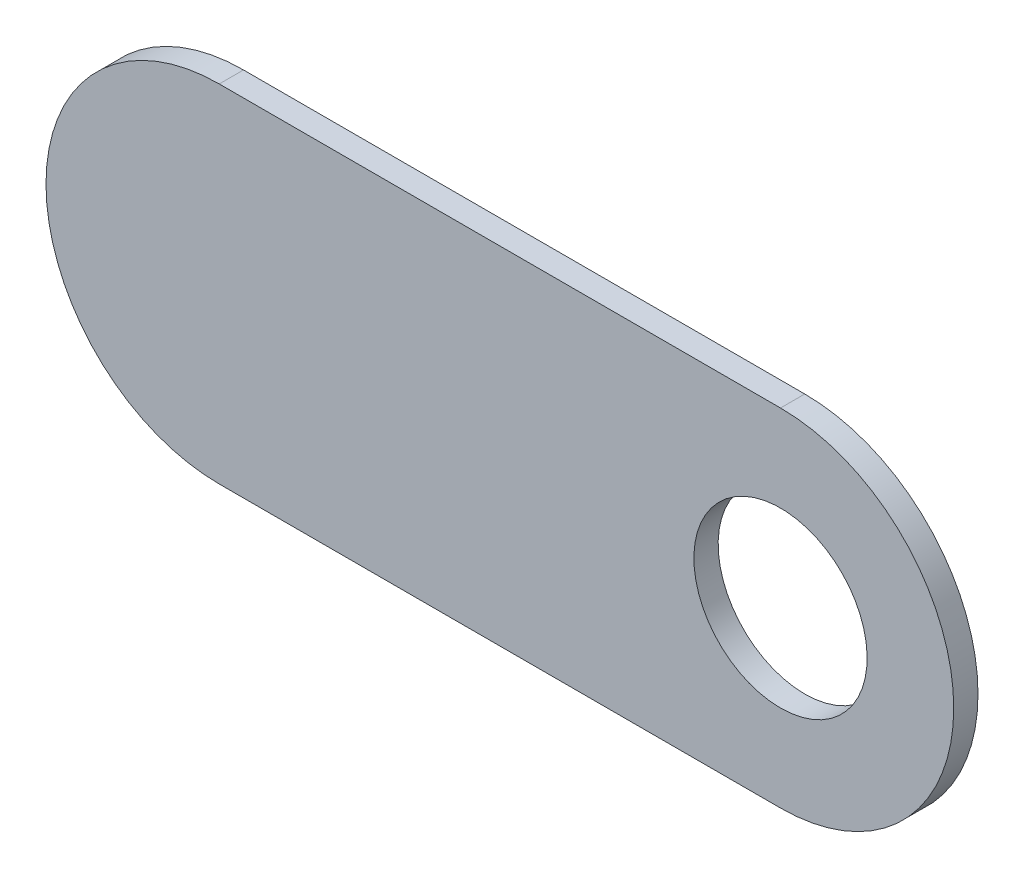
ISO-10303-21;
HEADER;
FILE_DESCRIPTION(('STEP AP214'),'2;1');
FILE_NAME('part.step','',(''),(''),'','','');
FILE_SCHEMA(('AUTOMOTIVE_DESIGN { 1 0 10303 214 1 1 1 1 }'));
ENDSEC;
DATA;
#1=APPLICATION_CONTEXT('core data for automotive mechanical design processes');
#2=APPLICATION_PROTOCOL_DEFINITION('international standard','automotive_design',2000,#1);
#3=PRODUCT_CONTEXT('',#1,'mechanical');
#4=PRODUCT('Part','Part','',(#3));
#5=PRODUCT_RELATED_PRODUCT_CATEGORY('part','',(#4));
#6=PRODUCT_DEFINITION_FORMATION('','',#4);
#7=PRODUCT_DEFINITION_CONTEXT('part definition',#1,'design');
#8=PRODUCT_DEFINITION('design','',#6,#7);
#9=PRODUCT_DEFINITION_SHAPE('','',#8);
#10=(LENGTH_UNIT() NAMED_UNIT(*) SI_UNIT(.MILLI.,.METRE.));
#11=(NAMED_UNIT(*) PLANE_ANGLE_UNIT() SI_UNIT($,.RADIAN.));
#12=(NAMED_UNIT(*) SI_UNIT($,.STERADIAN.) SOLID_ANGLE_UNIT());
#13=UNCERTAINTY_MEASURE_WITH_UNIT(LENGTH_MEASURE(1.E-05),#10,'distance_accuracy_value','');
#14=(GEOMETRIC_REPRESENTATION_CONTEXT(3) GLOBAL_UNCERTAINTY_ASSIGNED_CONTEXT((#13)) GLOBAL_UNIT_ASSIGNED_CONTEXT((#10,
#11,#12)) REPRESENTATION_CONTEXT('',''));
#15=CARTESIAN_POINT('',(0.,0.,0.));
#16=DIRECTION('',(0.,0.,1.));
#17=DIRECTION('',(1.,0.,0.));
#18=AXIS2_PLACEMENT_3D('',#15,#16,#17);
#19=CARTESIAN_POINT('',(79.4,-116.,-0.045));
#20=DIRECTION('',(0.,0.,-1.));
#21=DIRECTION('',(0.,-1.,0.));
#22=AXIS2_PLACEMENT_3D('',#19,#20,#21);
#23=CYLINDRICAL_SURFACE('',#22,0.125);
#24=CARTESIAN_POINT('',(79.4,-116.,1.6));
#25=DIRECTION('',(0.,0.,-1.));
#26=DIRECTION('',(0.,-1.,0.));
#27=AXIS2_PLACEMENT_3D('',#24,#25,#26);
#28=CIRCLE('',#27,0.125);
#29=CARTESIAN_POINT('',(79.4,-116.125,1.6));
#30=VERTEX_POINT('',#29);
#31=EDGE_CURVE('E114',#30,#30,#28,.T.);
#32=ORIENTED_EDGE('',*,*,#31,.T.);
#33=DIRECTION('',(0.,0.,1.));
#34=VECTOR('',#33,1.);
#35=CARTESIAN_POINT('',(79.4,-116.125,-0.045));
#36=LINE('',#35,#34);
#37=CARTESIAN_POINT('',(79.4,-116.125,1.635));
#38=VERTEX_POINT('',#37);
#39=EDGE_CURVE('E11',#30,#38,#36,.T.);
#40=ORIENTED_EDGE('',*,*,#39,.T.);
#41=CARTESIAN_POINT('',(79.4,-116.,1.635));
#42=DIRECTION('',(0.,0.,-1.));
#43=DIRECTION('',(0.,-1.,0.));
#44=AXIS2_PLACEMENT_3D('',#41,#42,#43);
#45=CIRCLE('',#44,0.125);
#46=EDGE_CURVE('E20',#38,#38,#45,.T.);
#47=ORIENTED_EDGE('',*,*,#46,.F.);
#48=ORIENTED_EDGE('',*,*,#39,.F.);
#49=EDGE_LOOP('',(#32,#40,#47,#48));
#50=FACE_BOUND('',#49,.T.);
#51=ADVANCED_FACE('F17',(#50),#23,.F.);
#52=CARTESIAN_POINT('',(78.59,-116.25,1.6));
#53=DIRECTION('',(0.,1.,0.));
#54=DIRECTION('',(1.,0.,0.));
#55=AXIS2_PLACEMENT_3D('',#52,#53,#54);
#56=PLANE('',#55);
#57=DIRECTION('',(1.,0.,0.));
#58=VECTOR('',#57,1.);
#59=CARTESIAN_POINT('',(78.59,-116.25,1.6));
#60=LINE('',#59,#58);
#61=CARTESIAN_POINT('',(78.59,-116.25,1.6));
#62=VERTEX_POINT('',#61);
#63=CARTESIAN_POINT('',(79.4,-116.25,1.6));
#64=VERTEX_POINT('',#63);
#65=EDGE_CURVE('E60',#62,#64,#60,.T.);
#66=ORIENTED_EDGE('',*,*,#65,.T.);
#67=DIRECTION('',(0.,0.,1.));
#68=VECTOR('',#67,1.);
#69=CARTESIAN_POINT('',(79.4,-116.25,1.6));
#70=LINE('',#69,#68);
#71=CARTESIAN_POINT('',(79.4,-116.25,1.635));
#72=VERTEX_POINT('',#71);
#73=EDGE_CURVE('E87',#64,#72,#70,.T.);
#74=ORIENTED_EDGE('',*,*,#73,.T.);
#75=DIRECTION('',(1.,0.,0.));
#76=VECTOR('',#75,1.);
#77=CARTESIAN_POINT('',(78.59,-116.25,1.635));
#78=LINE('',#77,#76);
#79=CARTESIAN_POINT('',(78.59,-116.25,1.635));
#80=VERTEX_POINT('',#79);
#81=EDGE_CURVE('E69',#80,#72,#78,.T.);
#82=ORIENTED_EDGE('',*,*,#81,.F.);
#83=DIRECTION('',(0.,0.,1.));
#84=VECTOR('',#83,1.);
#85=CARTESIAN_POINT('',(78.59,-116.25,1.6));
#86=LINE('',#85,#84);
#87=EDGE_CURVE('E125',#62,#80,#86,.T.);
#88=ORIENTED_EDGE('',*,*,#87,.F.);
#89=EDGE_LOOP('',(#66,#74,#82,#88));
#90=FACE_BOUND('',#89,.T.);
#91=ADVANCED_FACE('F154',(#90),#56,.F.);
#92=CARTESIAN_POINT('',(79.4,-115.75,1.635));
#93=DIRECTION('',(0.,0.,1.));
#94=DIRECTION('',(1.,0.,0.));
#95=AXIS2_PLACEMENT_3D('',#92,#93,#94);
#96=PLANE('',#95);
#97=ORIENTED_EDGE('',*,*,#46,.T.);
#98=EDGE_LOOP('',(#97));
#99=FACE_BOUND('',#98,.T.);
#100=DIRECTION('',(-1.,0.,0.));
#101=VECTOR('',#100,1.);
#102=CARTESIAN_POINT('',(79.4,-115.75,1.635));
#103=LINE('',#102,#101);
#104=CARTESIAN_POINT('',(79.4,-115.75,1.635));
#105=VERTEX_POINT('',#104);
#106=CARTESIAN_POINT('',(78.59,-115.75,1.635));
#107=VERTEX_POINT('',#106);
#108=EDGE_CURVE('E98',#105,#107,#103,.T.);
#109=ORIENTED_EDGE('',*,*,#108,.T.);
#110=CARTESIAN_POINT('',(78.59,-116.,1.635));
#111=DIRECTION('',(0.,0.,1.));
#112=DIRECTION('',(0.,1.,0.));
#113=AXIS2_PLACEMENT_3D('',#110,#111,#112);
#114=CIRCLE('',#113,0.25);
#115=EDGE_CURVE('E118',#107,#80,#114,.T.);
#116=ORIENTED_EDGE('',*,*,#115,.T.);
#117=ORIENTED_EDGE('',*,*,#81,.T.);
#118=CARTESIAN_POINT('',(79.4,-116.,1.635));
#119=DIRECTION('',(0.,0.,1.));
#120=DIRECTION('',(0.,-1.,0.));
#121=AXIS2_PLACEMENT_3D('',#118,#119,#120);
#122=CIRCLE('',#121,0.25);
#123=EDGE_CURVE('E90',#72,#105,#122,.T.);
#124=ORIENTED_EDGE('',*,*,#123,.T.);
#125=EDGE_LOOP('',(#109,#116,#117,#124));
#126=FACE_BOUND('',#125,.T.);
#127=ADVANCED_FACE('F144',(#99,#126),#96,.T.);
#128=CARTESIAN_POINT('',(79.4,-115.75,1.6));
#129=DIRECTION('',(0.,0.,1.));
#130=DIRECTION('',(1.,0.,0.));
#131=AXIS2_PLACEMENT_3D('',#128,#129,#130);
#132=PLANE('',#131);
#133=ORIENTED_EDGE('',*,*,#31,.F.);
#134=EDGE_LOOP('',(#133));
#135=FACE_BOUND('',#134,.T.);
#136=CARTESIAN_POINT('',(79.4,-116.,1.6));
#137=DIRECTION('',(0.,0.,1.));
#138=DIRECTION('',(0.,-1.,0.));
#139=AXIS2_PLACEMENT_3D('',#136,#137,#138);
#140=CIRCLE('',#139,0.25);
#141=CARTESIAN_POINT('',(79.4,-115.75,1.6));
#142=VERTEX_POINT('',#141);
#143=EDGE_CURVE('E81',#64,#142,#140,.T.);
#144=ORIENTED_EDGE('',*,*,#143,.F.);
#145=ORIENTED_EDGE('',*,*,#65,.F.);
#146=CARTESIAN_POINT('',(78.59,-116.,1.6));
#147=DIRECTION('',(0.,0.,1.));
#148=DIRECTION('',(0.,1.,0.));
#149=AXIS2_PLACEMENT_3D('',#146,#147,#148);
#150=CIRCLE('',#149,0.25);
#151=CARTESIAN_POINT('',(78.59,-115.75,1.6));
#152=VERTEX_POINT('',#151);
#153=EDGE_CURVE('E103',#152,#62,#150,.T.);
#154=ORIENTED_EDGE('',*,*,#153,.F.);
#155=DIRECTION('',(-1.,0.,0.));
#156=VECTOR('',#155,1.);
#157=CARTESIAN_POINT('',(79.4,-115.75,1.6));
#158=LINE('',#157,#156);
#159=EDGE_CURVE('E96',#142,#152,#158,.T.);
#160=ORIENTED_EDGE('',*,*,#159,.F.);
#161=EDGE_LOOP('',(#144,#145,#154,#160));
#162=FACE_BOUND('',#161,.T.);
#163=ADVANCED_FACE('F101',(#135,#162),#132,.F.);
#164=CARTESIAN_POINT('',(78.59,-116.,1.6));
#165=DIRECTION('',(0.,0.,-1.));
#166=DIRECTION('',(0.,1.,0.));
#167=AXIS2_PLACEMENT_3D('',#164,#165,#166);
#168=CYLINDRICAL_SURFACE('',#167,0.25);
#169=ORIENTED_EDGE('',*,*,#153,.T.);
#170=ORIENTED_EDGE('',*,*,#87,.T.);
#171=ORIENTED_EDGE('',*,*,#115,.F.);
#172=DIRECTION('',(0.,0.,1.));
#173=VECTOR('',#172,1.);
#174=CARTESIAN_POINT('',(78.59,-115.75,1.6));
#175=LINE('',#174,#173);
#176=EDGE_CURVE('E106',#152,#107,#175,.T.);
#177=ORIENTED_EDGE('',*,*,#176,.F.);
#178=EDGE_LOOP('',(#169,#170,#171,#177));
#179=FACE_BOUND('',#178,.T.);
#180=ADVANCED_FACE('F143',(#179),#168,.T.);
#181=CARTESIAN_POINT('',(79.4,-116.,1.6));
#182=DIRECTION('',(0.,0.,-1.));
#183=DIRECTION('',(0.,-1.,0.));
#184=AXIS2_PLACEMENT_3D('',#181,#182,#183);
#185=CYLINDRICAL_SURFACE('',#184,0.25);
#186=ORIENTED_EDGE('',*,*,#143,.T.);
#187=DIRECTION('',(0.,0.,1.));
#188=VECTOR('',#187,1.);
#189=CARTESIAN_POINT('',(79.4,-115.75,1.6));
#190=LINE('',#189,#188);
#191=EDGE_CURVE('E85',#142,#105,#190,.T.);
#192=ORIENTED_EDGE('',*,*,#191,.T.);
#193=ORIENTED_EDGE('',*,*,#123,.F.);
#194=ORIENTED_EDGE('',*,*,#73,.F.);
#195=EDGE_LOOP('',(#186,#192,#193,#194));
#196=FACE_BOUND('',#195,.T.);
#197=ADVANCED_FACE('F83',(#196),#185,.T.);
#198=CARTESIAN_POINT('',(79.4,-115.75,1.6));
#199=DIRECTION('',(0.,-1.,0.));
#200=DIRECTION('',(0.,0.,-1.));
#201=AXIS2_PLACEMENT_3D('',#198,#199,#200);
#202=PLANE('',#201);
#203=ORIENTED_EDGE('',*,*,#159,.T.);
#204=ORIENTED_EDGE('',*,*,#176,.T.);
#205=ORIENTED_EDGE('',*,*,#108,.F.);
#206=ORIENTED_EDGE('',*,*,#191,.F.);
#207=EDGE_LOOP('',(#203,#204,#205,#206));
#208=FACE_BOUND('',#207,.T.);
#209=ADVANCED_FACE('F94',(#208),#202,.F.);
#210=CLOSED_SHELL('',(#51,#91,#127,#163,#180,#197,#209));
#211=MANIFOLD_SOLID_BREP('B1',#210);
#212=ADVANCED_BREP_SHAPE_REPRESENTATION('',(#18,#211),#14);
#213=SHAPE_DEFINITION_REPRESENTATION(#9,#212);
ENDSEC;
END-ISO-10303-21;
